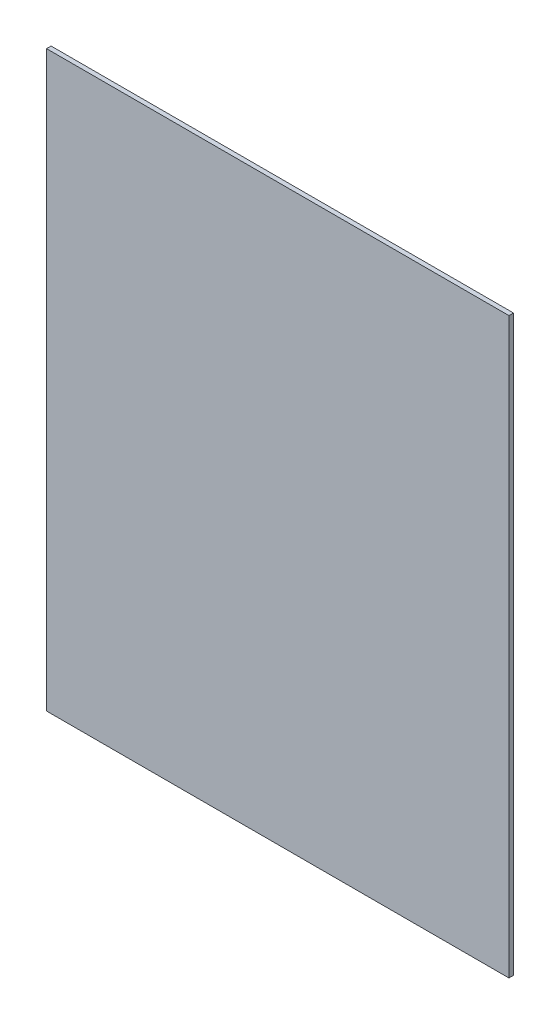
ISO-10303-21;
HEADER;
FILE_DESCRIPTION(('STEP AP214'),'2;1');
FILE_NAME('part.step','',(''),(''),'','','');
FILE_SCHEMA(('AUTOMOTIVE_DESIGN { 1 0 10303 214 1 1 1 1 }'));
ENDSEC;
DATA;
#1=APPLICATION_CONTEXT('core data for automotive mechanical design processes');
#2=APPLICATION_PROTOCOL_DEFINITION('international standard','automotive_design',2000,#1);
#3=PRODUCT_CONTEXT('',#1,'mechanical');
#4=PRODUCT('Part','Part','',(#3));
#5=PRODUCT_RELATED_PRODUCT_CATEGORY('part','',(#4));
#6=PRODUCT_DEFINITION_FORMATION('','',#4);
#7=PRODUCT_DEFINITION_CONTEXT('part definition',#1,'design');
#8=PRODUCT_DEFINITION('design','',#6,#7);
#9=PRODUCT_DEFINITION_SHAPE('','',#8);
#10=(LENGTH_UNIT() NAMED_UNIT(*) SI_UNIT(.MILLI.,.METRE.));
#11=(NAMED_UNIT(*) PLANE_ANGLE_UNIT() SI_UNIT($,.RADIAN.));
#12=(NAMED_UNIT(*) SI_UNIT($,.STERADIAN.) SOLID_ANGLE_UNIT());
#13=UNCERTAINTY_MEASURE_WITH_UNIT(LENGTH_MEASURE(1.E-05),#10,'distance_accuracy_value','');
#14=(GEOMETRIC_REPRESENTATION_CONTEXT(3) GLOBAL_UNCERTAINTY_ASSIGNED_CONTEXT((#13)) GLOBAL_UNIT_ASSIGNED_CONTEXT((#10,
#11,#12)) REPRESENTATION_CONTEXT('',''));
#15=CARTESIAN_POINT('',(0.,0.,0.));
#16=DIRECTION('',(0.,0.,1.));
#17=DIRECTION('',(1.,0.,0.));
#18=AXIS2_PLACEMENT_3D('',#15,#16,#17);
#19=CARTESIAN_POINT('',(-25.5,-31.635,0.5));
#20=DIRECTION('',(1.,0.,0.));
#21=DIRECTION('',(0.,0.,-1.));
#22=AXIS2_PLACEMENT_3D('',#19,#20,#21);
#23=PLANE('',#22);
#24=DIRECTION('',(0.,-1.,0.));
#25=VECTOR('',#24,1.);
#26=CARTESIAN_POINT('',(-25.5,-31.635,0.));
#27=LINE('',#26,#25);
#28=CARTESIAN_POINT('',(-25.5,31.635,0.));
#29=VERTEX_POINT('',#28);
#30=CARTESIAN_POINT('',(-25.5,-31.635,0.));
#31=VERTEX_POINT('',#30);
#32=EDGE_CURVE('E96',#29,#31,#27,.T.);
#33=ORIENTED_EDGE('',*,*,#32,.T.);
#34=DIRECTION('',(0.,0.,-1.));
#35=VECTOR('',#34,1.);
#36=CARTESIAN_POINT('',(-25.5,-31.635,0.5));
#37=LINE('',#36,#35);
#38=CARTESIAN_POINT('',(-25.5,-31.635,0.5));
#39=VERTEX_POINT('',#38);
#40=EDGE_CURVE('E11',#39,#31,#37,.T.);
#41=ORIENTED_EDGE('',*,*,#40,.F.);
#42=DIRECTION('',(0.,-1.,0.));
#43=VECTOR('',#42,1.);
#44=CARTESIAN_POINT('',(-25.5,-31.635,0.5));
#45=LINE('',#44,#43);
#46=CARTESIAN_POINT('',(-25.5,31.635,0.5));
#47=VERTEX_POINT('',#46);
#48=EDGE_CURVE('E84',#47,#39,#45,.T.);
#49=ORIENTED_EDGE('',*,*,#48,.F.);
#50=DIRECTION('',(0.,0.,-1.));
#51=VECTOR('',#50,1.);
#52=CARTESIAN_POINT('',(-25.5,31.635,0.5));
#53=LINE('',#52,#51);
#54=EDGE_CURVE('E92',#47,#29,#53,.T.);
#55=ORIENTED_EDGE('',*,*,#54,.T.);
#56=EDGE_LOOP('',(#33,#41,#49,#55));
#57=FACE_BOUND('',#56,.T.);
#58=ADVANCED_FACE('F33',(#57),#23,.F.);
#59=CARTESIAN_POINT('',(25.5,-31.635,0.5));
#60=DIRECTION('',(0.,1.,0.));
#61=DIRECTION('',(0.,0.,1.));
#62=AXIS2_PLACEMENT_3D('',#59,#60,#61);
#63=PLANE('',#62);
#64=DIRECTION('',(1.,0.,0.));
#65=VECTOR('',#64,1.);
#66=CARTESIAN_POINT('',(25.5,-31.635,0.));
#67=LINE('',#66,#65);
#68=CARTESIAN_POINT('',(25.5,-31.635,0.));
#69=VERTEX_POINT('',#68);
#70=EDGE_CURVE('E88',#31,#69,#67,.T.);
#71=ORIENTED_EDGE('',*,*,#70,.T.);
#72=DIRECTION('',(0.,0.,-1.));
#73=VECTOR('',#72,1.);
#74=CARTESIAN_POINT('',(25.5,-31.635,0.5));
#75=LINE('',#74,#73);
#76=CARTESIAN_POINT('',(25.5,-31.635,0.5));
#77=VERTEX_POINT('',#76);
#78=EDGE_CURVE('E41',#77,#69,#75,.T.);
#79=ORIENTED_EDGE('',*,*,#78,.F.);
#80=DIRECTION('',(1.,0.,0.));
#81=VECTOR('',#80,1.);
#82=CARTESIAN_POINT('',(25.5,-31.635,0.5));
#83=LINE('',#82,#81);
#84=EDGE_CURVE('E79',#39,#77,#83,.T.);
#85=ORIENTED_EDGE('',*,*,#84,.F.);
#86=ORIENTED_EDGE('',*,*,#40,.T.);
#87=EDGE_LOOP('',(#71,#79,#85,#86));
#88=FACE_BOUND('',#87,.T.);
#89=ADVANCED_FACE('F87',(#88),#63,.F.);
#90=CARTESIAN_POINT('',(25.5,-31.635,0.5));
#91=DIRECTION('',(-1.,0.,0.));
#92=DIRECTION('',(0.,0.,1.));
#93=AXIS2_PLACEMENT_3D('',#90,#91,#92);
#94=PLANE('',#93);
#95=DIRECTION('',(0.,1.,0.));
#96=VECTOR('',#95,1.);
#97=CARTESIAN_POINT('',(25.5,-31.635,0.));
#98=LINE('',#97,#96);
#99=CARTESIAN_POINT('',(25.5,31.635,0.));
#100=VERTEX_POINT('',#99);
#101=EDGE_CURVE('E66',#69,#100,#98,.T.);
#102=ORIENTED_EDGE('',*,*,#101,.T.);
#103=DIRECTION('',(0.,0.,-1.));
#104=VECTOR('',#103,1.);
#105=CARTESIAN_POINT('',(25.5,31.635,0.5));
#106=LINE('',#105,#104);
#107=CARTESIAN_POINT('',(25.5,31.635,0.5));
#108=VERTEX_POINT('',#107);
#109=EDGE_CURVE('E89',#108,#100,#106,.T.);
#110=ORIENTED_EDGE('',*,*,#109,.F.);
#111=DIRECTION('',(0.,1.,0.));
#112=VECTOR('',#111,1.);
#113=CARTESIAN_POINT('',(25.5,-31.635,0.5));
#114=LINE('',#113,#112);
#115=EDGE_CURVE('E82',#77,#108,#114,.T.);
#116=ORIENTED_EDGE('',*,*,#115,.F.);
#117=ORIENTED_EDGE('',*,*,#78,.T.);
#118=EDGE_LOOP('',(#102,#110,#116,#117));
#119=FACE_BOUND('',#118,.T.);
#120=ADVANCED_FACE('F90',(#119),#94,.F.);
#121=CARTESIAN_POINT('',(25.5,31.635,0.5));
#122=DIRECTION('',(0.,-1.,0.));
#123=DIRECTION('',(1.,0.,0.));
#124=AXIS2_PLACEMENT_3D('',#121,#122,#123);
#125=PLANE('',#124);
#126=DIRECTION('',(-1.,0.,0.));
#127=VECTOR('',#126,1.);
#128=CARTESIAN_POINT('',(25.5,31.635,0.));
#129=LINE('',#128,#127);
#130=EDGE_CURVE('E72',#100,#29,#129,.T.);
#131=ORIENTED_EDGE('',*,*,#130,.T.);
#132=ORIENTED_EDGE('',*,*,#54,.F.);
#133=DIRECTION('',(-1.,0.,0.));
#134=VECTOR('',#133,1.);
#135=CARTESIAN_POINT('',(25.5,31.635,0.5));
#136=LINE('',#135,#134);
#137=EDGE_CURVE('E49',#108,#47,#136,.T.);
#138=ORIENTED_EDGE('',*,*,#137,.F.);
#139=ORIENTED_EDGE('',*,*,#109,.T.);
#140=EDGE_LOOP('',(#131,#132,#138,#139));
#141=FACE_BOUND('',#140,.T.);
#142=ADVANCED_FACE('F103',(#141),#125,.F.);
#143=CARTESIAN_POINT('',(0.,0.,0.5));
#144=DIRECTION('',(0.,0.,1.));
#145=DIRECTION('',(1.,0.,0.));
#146=AXIS2_PLACEMENT_3D('',#143,#144,#145);
#147=PLANE('',#146);
#148=ORIENTED_EDGE('',*,*,#48,.T.);
#149=ORIENTED_EDGE('',*,*,#84,.T.);
#150=ORIENTED_EDGE('',*,*,#115,.T.);
#151=ORIENTED_EDGE('',*,*,#137,.T.);
#152=EDGE_LOOP('',(#148,#149,#150,#151));
#153=FACE_BOUND('',#152,.T.);
#154=ADVANCED_FACE('F80',(#153),#147,.T.);
#155=CARTESIAN_POINT('',(0.,0.,0.));
#156=DIRECTION('',(0.,0.,1.));
#157=DIRECTION('',(1.,0.,0.));
#158=AXIS2_PLACEMENT_3D('',#155,#156,#157);
#159=PLANE('',#158);
#160=ORIENTED_EDGE('',*,*,#32,.F.);
#161=ORIENTED_EDGE('',*,*,#130,.F.);
#162=ORIENTED_EDGE('',*,*,#101,.F.);
#163=ORIENTED_EDGE('',*,*,#70,.F.);
#164=EDGE_LOOP('',(#160,#161,#162,#163));
#165=FACE_BOUND('',#164,.T.);
#166=ADVANCED_FACE('F106',(#165),#159,.F.);
#167=CLOSED_SHELL('',(#58,#89,#120,#142,#154,#166));
#168=MANIFOLD_SOLID_BREP('B2',#167);
#169=ADVANCED_BREP_SHAPE_REPRESENTATION('',(#18,#168),#14);
#170=SHAPE_DEFINITION_REPRESENTATION(#9,#169);
ENDSEC;
END-ISO-10303-21;
